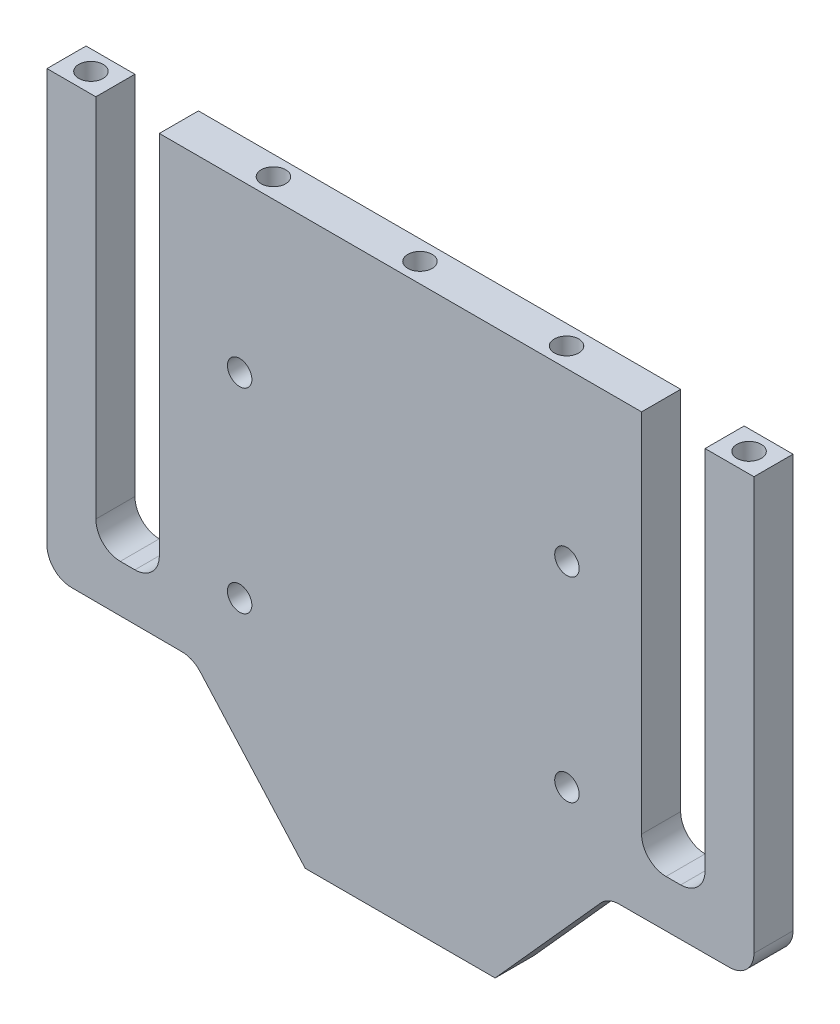
ISO-10303-21;
HEADER;
FILE_DESCRIPTION(('STEP AP214'),'2;1');
FILE_NAME('part.step','',(''),(''),'','','');
FILE_SCHEMA(('AUTOMOTIVE_DESIGN { 1 0 10303 214 1 1 1 1 }'));
ENDSEC;
DATA;
#1=APPLICATION_CONTEXT('core data for automotive mechanical design processes');
#2=APPLICATION_PROTOCOL_DEFINITION('international standard','automotive_design',2000,#1);
#3=PRODUCT_CONTEXT('',#1,'mechanical');
#4=PRODUCT('Part','Part','',(#3));
#5=PRODUCT_RELATED_PRODUCT_CATEGORY('part','',(#4));
#6=PRODUCT_DEFINITION_FORMATION('','',#4);
#7=PRODUCT_DEFINITION_CONTEXT('part definition',#1,'design');
#8=PRODUCT_DEFINITION('design','',#6,#7);
#9=PRODUCT_DEFINITION_SHAPE('','',#8);
#10=(LENGTH_UNIT() NAMED_UNIT(*) SI_UNIT(.MILLI.,.METRE.));
#11=(NAMED_UNIT(*) PLANE_ANGLE_UNIT() SI_UNIT($,.RADIAN.));
#12=(NAMED_UNIT(*) SI_UNIT($,.STERADIAN.) SOLID_ANGLE_UNIT());
#13=UNCERTAINTY_MEASURE_WITH_UNIT(LENGTH_MEASURE(1.E-05),#10,'distance_accuracy_value','');
#14=(GEOMETRIC_REPRESENTATION_CONTEXT(3) GLOBAL_UNCERTAINTY_ASSIGNED_CONTEXT((#13)) GLOBAL_UNIT_ASSIGNED_CONTEXT((#10,
#11,#12)) REPRESENTATION_CONTEXT('',''));
#15=CARTESIAN_POINT('',(0.,0.,0.));
#16=DIRECTION('',(0.,0.,1.));
#17=DIRECTION('',(1.,0.,0.));
#18=AXIS2_PLACEMENT_3D('',#15,#16,#17);
#19=CARTESIAN_POINT('',(142.361429131201,115.359943174136,8.01));
#20=DIRECTION('',(0.,-1.,0.));
#21=DIRECTION('',(0.,0.,-1.));
#22=AXIS2_PLACEMENT_3D('',#19,#20,#21);
#23=PLANE('',#22);
#24=CARTESIAN_POINT('',(137.361429131207,115.359943174136,4.));
#25=DIRECTION('',(0.,-1.,0.));
#26=DIRECTION('',(0.,0.,-1.));
#27=AXIS2_PLACEMENT_3D('',#24,#25,#26);
#28=CIRCLE('',#27,2.5);
#29=CARTESIAN_POINT('',(137.361429131207,115.359943174136,1.50000000000001));
#30=VERTEX_POINT('',#29);
#31=EDGE_CURVE('E944',#30,#30,#28,.T.);
#32=ORIENTED_EDGE('',*,*,#31,.T.);
#33=EDGE_LOOP('',(#32));
#34=FACE_BOUND('',#33,.T.);
#35=DIRECTION('',(1.,0.,0.));
#36=VECTOR('',#35,1.);
#37=CARTESIAN_POINT('',(114.734330831104,115.359943174136,8.));
#38=LINE('',#37,#36);
#39=CARTESIAN_POINT('',(132.361429131214,115.359943174136,8.));
#40=VERTEX_POINT('',#39);
#41=CARTESIAN_POINT('',(142.361429131201,115.359943174136,8.));
#42=VERTEX_POINT('',#41);
#43=EDGE_CURVE('E374',#40,#42,#38,.T.);
#44=ORIENTED_EDGE('',*,*,#43,.T.);
#45=DIRECTION('',(0.,0.,1.));
#46=VECTOR('',#45,1.);
#47=CARTESIAN_POINT('',(142.361429131201,115.359943174136,8.));
#48=LINE('',#47,#46);
#49=CARTESIAN_POINT('',(142.361429131201,115.359943174136,0.));
#50=VERTEX_POINT('',#49);
#51=EDGE_CURVE('E369',#50,#42,#48,.T.);
#52=ORIENTED_EDGE('',*,*,#51,.F.);
#53=DIRECTION('',(1.,0.,0.));
#54=VECTOR('',#53,1.);
#55=CARTESIAN_POINT('',(114.734330831104,115.359943174136,0.));
#56=LINE('',#55,#54);
#57=CARTESIAN_POINT('',(132.361429131214,115.359943174136,0.));
#58=VERTEX_POINT('',#57);
#59=EDGE_CURVE('E371',#58,#50,#56,.T.);
#60=ORIENTED_EDGE('',*,*,#59,.F.);
#61=DIRECTION('',(0.,0.,1.));
#62=VECTOR('',#61,1.);
#63=CARTESIAN_POINT('',(132.361429131214,115.359943174136,8.));
#64=LINE('',#63,#62);
#65=EDGE_CURVE('E45',#58,#40,#64,.T.);
#66=ORIENTED_EDGE('',*,*,#65,.T.);
#67=EDGE_LOOP('',(#44,#52,#60,#66));
#68=FACE_BOUND('',#67,.T.);
#69=ADVANCED_FACE('F41',(#34,#68),#23,.F.);
#70=CARTESIAN_POINT('',(100.,115.359943174136,4.));
#71=DIRECTION('',(0.,1.,0.));
#72=DIRECTION('',(0.,0.,1.));
#73=AXIS2_PLACEMENT_3D('',#70,#71,#72);
#74=CIRCLE('',#73,2.5);
#75=CARTESIAN_POINT('',(100.,115.359943174136,6.5));
#76=VERTEX_POINT('',#75);
#77=EDGE_CURVE('E924',#76,#76,#74,.F.);
#78=ORIENTED_EDGE('',*,*,#77,.T.);
#79=EDGE_LOOP('',(#78));
#80=FACE_BOUND('',#79,.T.);
#81=CARTESIAN_POINT('',(40.,115.359943174136,4.));
#82=DIRECTION('',(0.,-1.,0.));
#83=DIRECTION('',(0.,0.,-1.));
#84=AXIS2_PLACEMENT_3D('',#81,#82,#83);
#85=CIRCLE('',#84,2.5);
#86=CARTESIAN_POINT('',(40.,115.359943174136,1.50000000000001));
#87=VERTEX_POINT('',#86);
#88=EDGE_CURVE('E932',#87,#87,#85,.T.);
#89=ORIENTED_EDGE('',*,*,#88,.T.);
#90=EDGE_LOOP('',(#89));
#91=FACE_BOUND('',#90,.T.);
#92=CARTESIAN_POINT('',(70.,115.359943174136,4.));
#93=DIRECTION('',(0.,-1.,0.));
#94=DIRECTION('',(0.,0.,-1.));
#95=AXIS2_PLACEMENT_3D('',#92,#93,#94);
#96=CIRCLE('',#95,2.5);
#97=CARTESIAN_POINT('',(70.,115.359943174136,1.50000000000001));
#98=VERTEX_POINT('',#97);
#99=EDGE_CURVE('E938',#98,#98,#96,.T.);
#100=ORIENTED_EDGE('',*,*,#99,.T.);
#101=EDGE_LOOP('',(#100));
#102=FACE_BOUND('',#101,.T.);
#103=DIRECTION('',(0.,0.,-1.));
#104=VECTOR('',#103,1.);
#105=CARTESIAN_POINT('',(119.361429131214,115.359943174136,8.));
#106=LINE('',#105,#104);
#107=CARTESIAN_POINT('',(119.361429131214,115.359943174136,8.));
#108=VERTEX_POINT('',#107);
#109=CARTESIAN_POINT('',(119.361429131214,115.359943174136,0.));
#110=VERTEX_POINT('',#109);
#111=EDGE_CURVE('E380',#108,#110,#106,.T.);
#112=ORIENTED_EDGE('',*,*,#111,.T.);
#113=CARTESIAN_POINT('',(20.6385708687968,115.359943174136,0.));
#114=VERTEX_POINT('',#113);
#115=EDGE_CURVE('E373',#114,#110,#56,.T.);
#116=ORIENTED_EDGE('',*,*,#115,.F.);
#117=DIRECTION('',(0.,0.,1.));
#118=VECTOR('',#117,1.);
#119=CARTESIAN_POINT('',(20.6385708687968,115.359943174136,8.));
#120=LINE('',#119,#118);
#121=CARTESIAN_POINT('',(20.6385708687968,115.359943174136,8.));
#122=VERTEX_POINT('',#121);
#123=EDGE_CURVE('E50',#114,#122,#120,.T.);
#124=ORIENTED_EDGE('',*,*,#123,.T.);
#125=EDGE_CURVE('E377',#122,#108,#38,.T.);
#126=ORIENTED_EDGE('',*,*,#125,.T.);
#127=EDGE_LOOP('',(#112,#116,#124,#126));
#128=FACE_BOUND('',#127,.T.);
#129=ADVANCED_FACE('F414',(#80,#91,#102,#128),#23,.F.);
#130=CARTESIAN_POINT('',(2.63857086880265,115.359943174136,4.));
#131=DIRECTION('',(0.,-1.,0.));
#132=DIRECTION('',(0.,0.,-1.));
#133=AXIS2_PLACEMENT_3D('',#130,#131,#132);
#134=CIRCLE('',#133,2.5);
#135=CARTESIAN_POINT('',(2.63857086880265,115.359943174136,1.5));
#136=VERTEX_POINT('',#135);
#137=EDGE_CURVE('E927',#136,#136,#134,.T.);
#138=ORIENTED_EDGE('',*,*,#137,.T.);
#139=EDGE_LOOP('',(#138));
#140=FACE_BOUND('',#139,.T.);
#141=CARTESIAN_POINT('',(-2.3614291311915,115.359943174136,8.));
#142=VERTEX_POINT('',#141);
#143=CARTESIAN_POINT('',(7.63857086879679,115.359943174136,8.));
#144=VERTEX_POINT('',#143);
#145=EDGE_CURVE('E378',#142,#144,#38,.T.);
#146=ORIENTED_EDGE('',*,*,#145,.T.);
#147=DIRECTION('',(0.,0.,-1.));
#148=VECTOR('',#147,1.);
#149=CARTESIAN_POINT('',(7.63857086879679,115.359943174136,8.));
#150=LINE('',#149,#148);
#151=CARTESIAN_POINT('',(7.63857086879679,115.359943174136,0.));
#152=VERTEX_POINT('',#151);
#153=EDGE_CURVE('E11',#144,#152,#150,.T.);
#154=ORIENTED_EDGE('',*,*,#153,.T.);
#155=CARTESIAN_POINT('',(-2.3614291311915,115.359943174136,0.));
#156=VERTEX_POINT('',#155);
#157=EDGE_CURVE('E58',#156,#152,#56,.T.);
#158=ORIENTED_EDGE('',*,*,#157,.F.);
#159=DIRECTION('',(0.,0.,-1.));
#160=VECTOR('',#159,1.);
#161=CARTESIAN_POINT('',(-2.3614291311915,115.359943174136,8.));
#162=LINE('',#161,#160);
#163=EDGE_CURVE('E366',#142,#156,#162,.T.);
#164=ORIENTED_EDGE('',*,*,#163,.F.);
#165=EDGE_LOOP('',(#146,#154,#158,#164));
#166=FACE_BOUND('',#165,.T.);
#167=ADVANCED_FACE('F43',(#140,#166),#23,.F.);
#168=CARTESIAN_POINT('',(114.734330831104,20.7823478267735,8.));
#169=DIRECTION('',(0.,0.,1.));
#170=DIRECTION('',(1.,0.,0.));
#171=AXIS2_PLACEMENT_3D('',#168,#169,#170);
#172=PLANE('',#171);
#173=CARTESIAN_POINT('',(37.0785708687969,41.1924926620058,8.));
#174=DIRECTION('',(0.,0.,1.));
#175=DIRECTION('',(1.,0.,0.));
#176=AXIS2_PLACEMENT_3D('',#173,#174,#175);
#177=CIRCLE('',#176,2.5);
#178=CARTESIAN_POINT('',(39.5785708687969,41.1924926620058,8.));
#179=VERTEX_POINT('',#178);
#180=EDGE_CURVE('E905',#179,#179,#177,.T.);
#181=ORIENTED_EDGE('',*,*,#180,.F.);
#182=EDGE_LOOP('',(#181));
#183=FACE_BOUND('',#182,.T.);
#184=CARTESIAN_POINT('',(104.078570868797,41.1924926620058,8.));
#185=DIRECTION('',(0.,0.,1.));
#186=DIRECTION('',(1.,0.,0.));
#187=AXIS2_PLACEMENT_3D('',#184,#185,#186);
#188=CIRCLE('',#187,2.5);
#189=CARTESIAN_POINT('',(106.578570868797,41.1924926620058,8.));
#190=VERTEX_POINT('',#189);
#191=EDGE_CURVE('E909',#190,#190,#188,.T.);
#192=ORIENTED_EDGE('',*,*,#191,.F.);
#193=EDGE_LOOP('',(#192));
#194=FACE_BOUND('',#193,.T.);
#195=CARTESIAN_POINT('',(104.078570868797,81.1924926620058,8.));
#196=DIRECTION('',(0.,0.,1.));
#197=DIRECTION('',(1.,0.,0.));
#198=AXIS2_PLACEMENT_3D('',#195,#196,#197);
#199=CIRCLE('',#198,2.5);
#200=CARTESIAN_POINT('',(106.578570868797,81.1924926620058,8.));
#201=VERTEX_POINT('',#200);
#202=EDGE_CURVE('E921',#201,#201,#199,.T.);
#203=ORIENTED_EDGE('',*,*,#202,.F.);
#204=EDGE_LOOP('',(#203));
#205=FACE_BOUND('',#204,.T.);
#206=CARTESIAN_POINT('',(37.0785708687969,81.1924926620058,8.));
#207=DIRECTION('',(0.,0.,1.));
#208=DIRECTION('',(1.,0.,0.));
#209=AXIS2_PLACEMENT_3D('',#206,#207,#208);
#210=CIRCLE('',#209,2.5);
#211=CARTESIAN_POINT('',(39.5785708687969,81.1924926620058,8.));
#212=VERTEX_POINT('',#211);
#213=EDGE_CURVE('E918',#212,#212,#210,.T.);
#214=ORIENTED_EDGE('',*,*,#213,.F.);
#215=EDGE_LOOP('',(#214));
#216=FACE_BOUND('',#215,.T.);
#217=ORIENTED_EDGE('',*,*,#145,.F.);
#218=DIRECTION('',(0.,-1.,0.));
#219=VECTOR('',#218,1.);
#220=CARTESIAN_POINT('',(-2.3614291311915,214.274017901078,8.));
#221=LINE('',#220,#219);
#222=CARTESIAN_POINT('',(-2.36142913119149,30.8599431741363,8.));
#223=VERTEX_POINT('',#222);
#224=EDGE_CURVE('E307',#142,#223,#221,.T.);
#225=ORIENTED_EDGE('',*,*,#224,.T.);
#226=CARTESIAN_POINT('',(2.63857086880851,30.8599431741363,8.));
#227=DIRECTION('',(0.,0.,1.));
#228=DIRECTION('',(-1.,0.,0.));
#229=AXIS2_PLACEMENT_3D('',#226,#227,#228);
#230=CIRCLE('',#229,5.);
#231=CARTESIAN_POINT('',(2.63857086880812,25.8599431741363,8.));
#232=VERTEX_POINT('',#231);
#233=EDGE_CURVE('E309',#223,#232,#230,.T.);
#234=ORIENTED_EDGE('',*,*,#233,.T.);
#235=DIRECTION('',(0.999994124417924,-0.00342799206976642,0.));
#236=VECTOR('',#235,1.);
#237=CARTESIAN_POINT('',(25.2828091292453,25.7823184488632,8.));
#238=LINE('',#237,#236);
#239=CARTESIAN_POINT('',(25.2828091292453,25.7823184488632,8.));
#240=VERTEX_POINT('',#239);
#241=EDGE_CURVE('E311',#232,#240,#238,.T.);
#242=ORIENTED_EDGE('',*,*,#241,.T.);
#243=CARTESIAN_POINT('',(25.2656691688965,20.7823478267735,8.));
#244=DIRECTION('',(0.,0.,-1.));
#245=DIRECTION('',(-1.,0.,0.));
#246=AXIS2_PLACEMENT_3D('',#243,#244,#245);
#247=CIRCLE('',#246,5.);
#248=CARTESIAN_POINT('',(28.9972260111802,24.1103327325094,8.));
#249=VERTEX_POINT('',#248);
#250=EDGE_CURVE('E313',#240,#249,#247,.T.);
#251=ORIENTED_EDGE('',*,*,#250,.T.);
#252=DIRECTION('',(0.665596981147171,-0.74631136845674,0.));
#253=VECTOR('',#252,1.);
#254=CARTESIAN_POINT('',(28.9972260111802,24.1103327325094,8.));
#255=LINE('',#254,#253);
#256=CARTESIAN_POINT('',(50.5,0.,8.));
#257=VERTEX_POINT('',#256);
#258=EDGE_CURVE('E290',#249,#257,#255,.T.);
#259=ORIENTED_EDGE('',*,*,#258,.T.);
#260=DIRECTION('',(1.,0.,0.));
#261=VECTOR('',#260,1.);
#262=CARTESIAN_POINT('',(89.3828592898621,0.,8.));
#263=LINE('',#262,#261);
#264=CARTESIAN_POINT('',(89.3828592898621,0.,8.));
#265=VERTEX_POINT('',#264);
#266=EDGE_CURVE('E293',#257,#265,#263,.T.);
#267=ORIENTED_EDGE('',*,*,#266,.T.);
#268=DIRECTION('',(0.667609283497738,0.744511816284763,0.));
#269=VECTOR('',#268,1.);
#270=CARTESIAN_POINT('',(89.3828592898621,0.,8.));
#271=LINE('',#270,#269);
#272=CARTESIAN_POINT('',(111.00277398882,24.1103327325094,8.));
#273=VERTEX_POINT('',#272);
#274=EDGE_CURVE('E296',#265,#273,#271,.T.);
#275=ORIENTED_EDGE('',*,*,#274,.T.);
#276=CARTESIAN_POINT('',(114.734330831104,20.7823478267735,8.));
#277=DIRECTION('',(0.,0.,-1.));
#278=DIRECTION('',(1.,0.,0.));
#279=AXIS2_PLACEMENT_3D('',#276,#277,#278);
#280=CIRCLE('',#279,5.);
#281=CARTESIAN_POINT('',(114.717190870755,25.7823184488632,8.));
#282=VERTEX_POINT('',#281);
#283=EDGE_CURVE('E298',#273,#282,#280,.T.);
#284=ORIENTED_EDGE('',*,*,#283,.T.);
#285=DIRECTION('',(0.999994124417924,0.00342799206976557,0.));
#286=VECTOR('',#285,1.);
#287=CARTESIAN_POINT('',(114.717190870755,25.7823184488632,8.));
#288=LINE('',#287,#286);
#289=CARTESIAN_POINT('',(137.361429131203,25.8599431741363,8.));
#290=VERTEX_POINT('',#289);
#291=EDGE_CURVE('E300',#282,#290,#288,.T.);
#292=ORIENTED_EDGE('',*,*,#291,.T.);
#293=CARTESIAN_POINT('',(137.361429131202,30.8599431741363,8.));
#294=DIRECTION('',(0.,0.,1.));
#295=DIRECTION('',(1.,0.,0.));
#296=AXIS2_PLACEMENT_3D('',#293,#294,#295);
#297=CIRCLE('',#296,4.99999999999935);
#298=CARTESIAN_POINT('',(142.361429131202,30.8599431741363,8.));
#299=VERTEX_POINT('',#298);
#300=EDGE_CURVE('E302',#290,#299,#297,.T.);
#301=ORIENTED_EDGE('',*,*,#300,.T.);
#302=DIRECTION('',(0.,1.,0.));
#303=VECTOR('',#302,1.);
#304=CARTESIAN_POINT('',(142.361429131201,214.274017901078,8.));
#305=LINE('',#304,#303);
#306=EDGE_CURVE('E304',#299,#42,#305,.T.);
#307=ORIENTED_EDGE('',*,*,#306,.T.);
#308=ORIENTED_EDGE('',*,*,#43,.F.);
#309=DIRECTION('',(0.,1.,0.));
#310=VECTOR('',#309,1.);
#311=CARTESIAN_POINT('',(132.361429131214,213.625959477353,8.));
#312=LINE('',#311,#310);
#313=CARTESIAN_POINT('',(132.361429131214,40.4924926620058,8.));
#314=VERTEX_POINT('',#313);
#315=EDGE_CURVE('E262',#314,#40,#312,.T.);
#316=ORIENTED_EDGE('',*,*,#315,.F.);
#317=CARTESIAN_POINT('',(127.361429131214,40.4924926620058,8.));
#318=DIRECTION('',(0.,0.,1.));
#319=DIRECTION('',(1.,0.,0.));
#320=AXIS2_PLACEMENT_3D('',#317,#318,#319);
#321=CIRCLE('',#320,5.);
#322=CARTESIAN_POINT('',(127.361429131214,35.4924926620058,8.));
#323=VERTEX_POINT('',#322);
#324=EDGE_CURVE('E260',#323,#314,#321,.T.);
#325=ORIENTED_EDGE('',*,*,#324,.F.);
#326=DIRECTION('',(1.,0.,0.));
#327=VECTOR('',#326,1.);
#328=CARTESIAN_POINT('',(127.361429131214,35.4924926620058,8.));
#329=LINE('',#328,#327);
#330=CARTESIAN_POINT('',(124.361429131214,35.4924926620058,8.));
#331=VERTEX_POINT('',#330);
#332=EDGE_CURVE('E257',#331,#323,#329,.T.);
#333=ORIENTED_EDGE('',*,*,#332,.F.);
#334=CARTESIAN_POINT('',(124.361429131214,40.4924926620058,8.));
#335=DIRECTION('',(0.,0.,1.));
#336=DIRECTION('',(-1.,0.,0.));
#337=AXIS2_PLACEMENT_3D('',#334,#335,#336);
#338=CIRCLE('',#337,5.);
#339=CARTESIAN_POINT('',(119.361429131214,40.4924926620058,8.));
#340=VERTEX_POINT('',#339);
#341=EDGE_CURVE('E255',#340,#331,#338,.T.);
#342=ORIENTED_EDGE('',*,*,#341,.F.);
#343=DIRECTION('',(0.,-1.,0.));
#344=VECTOR('',#343,1.);
#345=CARTESIAN_POINT('',(119.361429131214,40.4924926620058,8.));
#346=LINE('',#345,#344);
#347=EDGE_CURVE('E265',#108,#340,#346,.T.);
#348=ORIENTED_EDGE('',*,*,#347,.F.);
#349=ORIENTED_EDGE('',*,*,#125,.F.);
#350=DIRECTION('',(0.,1.,0.));
#351=VECTOR('',#350,1.);
#352=CARTESIAN_POINT('',(20.6385708687969,40.4924926620058,8.));
#353=LINE('',#352,#351);
#354=CARTESIAN_POINT('',(20.6385708687969,40.4924926620058,8.));
#355=VERTEX_POINT('',#354);
#356=EDGE_CURVE('E232',#355,#122,#353,.T.);
#357=ORIENTED_EDGE('',*,*,#356,.F.);
#358=CARTESIAN_POINT('',(15.6385708687969,40.4924926620058,8.));
#359=DIRECTION('',(0.,0.,1.));
#360=DIRECTION('',(1.,0.,0.));
#361=AXIS2_PLACEMENT_3D('',#358,#359,#360);
#362=CIRCLE('',#361,5.);
#363=CARTESIAN_POINT('',(15.6385708687968,35.4924926620058,8.));
#364=VERTEX_POINT('',#363);
#365=EDGE_CURVE('E230',#364,#355,#362,.T.);
#366=ORIENTED_EDGE('',*,*,#365,.F.);
#367=DIRECTION('',(1.,0.,0.));
#368=VECTOR('',#367,1.);
#369=CARTESIAN_POINT('',(12.6385708687969,35.4924926620058,8.));
#370=LINE('',#369,#368);
#371=CARTESIAN_POINT('',(12.6385708687969,35.4924926620058,8.));
#372=VERTEX_POINT('',#371);
#373=EDGE_CURVE('E215',#372,#364,#370,.T.);
#374=ORIENTED_EDGE('',*,*,#373,.F.);
#375=CARTESIAN_POINT('',(12.6385708687968,40.4924926620058,8.));
#376=DIRECTION('',(0.,0.,1.));
#377=DIRECTION('',(-1.,0.,0.));
#378=AXIS2_PLACEMENT_3D('',#375,#376,#377);
#379=CIRCLE('',#378,5.);
#380=CARTESIAN_POINT('',(7.63857086879684,40.4924926620058,8.));
#381=VERTEX_POINT('',#380);
#382=EDGE_CURVE('E204',#381,#372,#379,.T.);
#383=ORIENTED_EDGE('',*,*,#382,.F.);
#384=DIRECTION('',(0.,-1.,0.));
#385=VECTOR('',#384,1.);
#386=CARTESIAN_POINT('',(7.63857086879674,213.625959477353,8.));
#387=LINE('',#386,#385);
#388=EDGE_CURVE('E238',#144,#381,#387,.T.);
#389=ORIENTED_EDGE('',*,*,#388,.F.);
#390=EDGE_LOOP('',(#217,#225,#234,#242,#251,#259,#267,#275,#284,#292,#301,#307,#308,#316,#325,
#333,#342,#348,#349,#357,#366,#374,#383,#389));
#391=FACE_BOUND('',#390,.T.);
#392=ADVANCED_FACE('F228',(#183,#194,#205,#216,#391),#172,.T.);
#393=CARTESIAN_POINT('',(114.734330831104,20.7823478267735,0.));
#394=DIRECTION('',(0.,0.,1.));
#395=DIRECTION('',(1.,0.,0.));
#396=AXIS2_PLACEMENT_3D('',#393,#394,#395);
#397=PLANE('',#396);
#398=CARTESIAN_POINT('',(37.0785708687969,41.1924926620058,0.));
#399=DIRECTION('',(0.,0.,1.));
#400=DIRECTION('',(1.,0.,0.));
#401=AXIS2_PLACEMENT_3D('',#398,#399,#400);
#402=CIRCLE('',#401,2.5);
#403=CARTESIAN_POINT('',(39.5785708687969,41.1924926620058,0.));
#404=VERTEX_POINT('',#403);
#405=EDGE_CURVE('E902',#404,#404,#402,.T.);
#406=ORIENTED_EDGE('',*,*,#405,.T.);
#407=EDGE_LOOP('',(#406));
#408=FACE_BOUND('',#407,.T.);
#409=CARTESIAN_POINT('',(104.078570868797,41.1924926620058,0.));
#410=DIRECTION('',(0.,0.,1.));
#411=DIRECTION('',(1.,0.,0.));
#412=AXIS2_PLACEMENT_3D('',#409,#410,#411);
#413=CIRCLE('',#412,2.5);
#414=CARTESIAN_POINT('',(106.578570868797,41.1924926620058,0.));
#415=VERTEX_POINT('',#414);
#416=EDGE_CURVE('E906',#415,#415,#413,.T.);
#417=ORIENTED_EDGE('',*,*,#416,.T.);
#418=EDGE_LOOP('',(#417));
#419=FACE_BOUND('',#418,.T.);
#420=CARTESIAN_POINT('',(104.078570868797,81.1924926620058,0.));
#421=DIRECTION('',(0.,0.,1.));
#422=DIRECTION('',(1.,0.,0.));
#423=AXIS2_PLACEMENT_3D('',#420,#421,#422);
#424=CIRCLE('',#423,2.5);
#425=CARTESIAN_POINT('',(106.578570868797,81.1924926620058,0.));
#426=VERTEX_POINT('',#425);
#427=EDGE_CURVE('E966',#426,#426,#424,.T.);
#428=ORIENTED_EDGE('',*,*,#427,.T.);
#429=EDGE_LOOP('',(#428));
#430=FACE_BOUND('',#429,.T.);
#431=CARTESIAN_POINT('',(37.0785708687969,81.1924926620058,0.));
#432=DIRECTION('',(0.,0.,1.));
#433=DIRECTION('',(1.,0.,0.));
#434=AXIS2_PLACEMENT_3D('',#431,#432,#433);
#435=CIRCLE('',#434,2.5);
#436=CARTESIAN_POINT('',(39.5785708687969,81.1924926620058,0.));
#437=VERTEX_POINT('',#436);
#438=EDGE_CURVE('E914',#437,#437,#435,.T.);
#439=ORIENTED_EDGE('',*,*,#438,.T.);
#440=EDGE_LOOP('',(#439));
#441=FACE_BOUND('',#440,.T.);
#442=DIRECTION('',(0.,-1.,0.));
#443=VECTOR('',#442,1.);
#444=CARTESIAN_POINT('',(-2.3614291311915,214.274017901078,0.));
#445=LINE('',#444,#443);
#446=CARTESIAN_POINT('',(-2.36142913119149,30.8599431741363,0.));
#447=VERTEX_POINT('',#446);
#448=EDGE_CURVE('E331',#156,#447,#445,.T.);
#449=ORIENTED_EDGE('',*,*,#448,.F.);
#450=ORIENTED_EDGE('',*,*,#157,.T.);
#451=DIRECTION('',(0.,-1.,0.));
#452=VECTOR('',#451,1.);
#453=CARTESIAN_POINT('',(7.63857086879674,213.625959477353,0.));
#454=LINE('',#453,#452);
#455=CARTESIAN_POINT('',(7.63857086879684,40.4924926620058,0.));
#456=VERTEX_POINT('',#455);
#457=EDGE_CURVE('E216',#152,#456,#454,.T.);
#458=ORIENTED_EDGE('',*,*,#457,.T.);
#459=CARTESIAN_POINT('',(12.6385708687968,40.4924926620058,0.));
#460=DIRECTION('',(0.,0.,1.));
#461=DIRECTION('',(-1.,0.,0.));
#462=AXIS2_PLACEMENT_3D('',#459,#460,#461);
#463=CIRCLE('',#462,5.);
#464=CARTESIAN_POINT('',(12.6385708687969,35.4924926620058,0.));
#465=VERTEX_POINT('',#464);
#466=EDGE_CURVE('E240',#456,#465,#463,.T.);
#467=ORIENTED_EDGE('',*,*,#466,.T.);
#468=DIRECTION('',(1.,0.,0.));
#469=VECTOR('',#468,1.);
#470=CARTESIAN_POINT('',(12.6385708687969,35.4924926620058,0.));
#471=LINE('',#470,#469);
#472=CARTESIAN_POINT('',(15.6385708687968,35.4924926620058,0.));
#473=VERTEX_POINT('',#472);
#474=EDGE_CURVE('E222',#465,#473,#471,.T.);
#475=ORIENTED_EDGE('',*,*,#474,.T.);
#476=CARTESIAN_POINT('',(15.6385708687969,40.4924926620058,0.));
#477=DIRECTION('',(0.,0.,1.));
#478=DIRECTION('',(1.,0.,0.));
#479=AXIS2_PLACEMENT_3D('',#476,#477,#478);
#480=CIRCLE('',#479,5.);
#481=CARTESIAN_POINT('',(20.6385708687969,40.4924926620058,0.));
#482=VERTEX_POINT('',#481);
#483=EDGE_CURVE('E244',#473,#482,#480,.T.);
#484=ORIENTED_EDGE('',*,*,#483,.T.);
#485=DIRECTION('',(0.,1.,0.));
#486=VECTOR('',#485,1.);
#487=CARTESIAN_POINT('',(20.6385708687969,40.4924926620058,0.));
#488=LINE('',#487,#486);
#489=EDGE_CURVE('E247',#482,#114,#488,.T.);
#490=ORIENTED_EDGE('',*,*,#489,.T.);
#491=ORIENTED_EDGE('',*,*,#115,.T.);
#492=DIRECTION('',(0.,-1.,0.));
#493=VECTOR('',#492,1.);
#494=CARTESIAN_POINT('',(119.361429131214,40.4924926620058,0.));
#495=LINE('',#494,#493);
#496=CARTESIAN_POINT('',(119.361429131214,40.4924926620058,0.));
#497=VERTEX_POINT('',#496);
#498=EDGE_CURVE('E258',#110,#497,#495,.T.);
#499=ORIENTED_EDGE('',*,*,#498,.T.);
#500=CARTESIAN_POINT('',(124.361429131214,40.4924926620058,0.));
#501=DIRECTION('',(0.,0.,1.));
#502=DIRECTION('',(-1.,0.,0.));
#503=AXIS2_PLACEMENT_3D('',#500,#501,#502);
#504=CIRCLE('',#503,5.);
#505=CARTESIAN_POINT('',(124.361429131214,35.4924926620058,0.));
#506=VERTEX_POINT('',#505);
#507=EDGE_CURVE('E223',#497,#506,#504,.T.);
#508=ORIENTED_EDGE('',*,*,#507,.T.);
#509=DIRECTION('',(1.,0.,0.));
#510=VECTOR('',#509,1.);
#511=CARTESIAN_POINT('',(127.361429131214,35.4924926620058,0.));
#512=LINE('',#511,#510);
#513=CARTESIAN_POINT('',(127.361429131214,35.4924926620058,0.));
#514=VERTEX_POINT('',#513);
#515=EDGE_CURVE('E270',#506,#514,#512,.T.);
#516=ORIENTED_EDGE('',*,*,#515,.T.);
#517=CARTESIAN_POINT('',(127.361429131214,40.4924926620058,0.));
#518=DIRECTION('',(0.,0.,1.));
#519=DIRECTION('',(1.,0.,0.));
#520=AXIS2_PLACEMENT_3D('',#517,#518,#519);
#521=CIRCLE('',#520,5.);
#522=CARTESIAN_POINT('',(132.361429131214,40.4924926620058,0.));
#523=VERTEX_POINT('',#522);
#524=EDGE_CURVE('E273',#514,#523,#521,.T.);
#525=ORIENTED_EDGE('',*,*,#524,.T.);
#526=DIRECTION('',(0.,1.,0.));
#527=VECTOR('',#526,1.);
#528=CARTESIAN_POINT('',(132.361429131214,213.625959477353,0.));
#529=LINE('',#528,#527);
#530=EDGE_CURVE('E276',#523,#58,#529,.T.);
#531=ORIENTED_EDGE('',*,*,#530,.T.);
#532=ORIENTED_EDGE('',*,*,#59,.T.);
#533=DIRECTION('',(0.,1.,0.));
#534=VECTOR('',#533,1.);
#535=CARTESIAN_POINT('',(142.361429131201,214.274017901078,0.));
#536=LINE('',#535,#534);
#537=CARTESIAN_POINT('',(142.361429131202,30.8599431741363,0.));
#538=VERTEX_POINT('',#537);
#539=EDGE_CURVE('E328',#538,#50,#536,.T.);
#540=ORIENTED_EDGE('',*,*,#539,.F.);
#541=CARTESIAN_POINT('',(137.361429131202,30.8599431741363,0.));
#542=DIRECTION('',(0.,0.,1.));
#543=DIRECTION('',(1.,0.,0.));
#544=AXIS2_PLACEMENT_3D('',#541,#542,#543);
#545=CIRCLE('',#544,4.99999999999935);
#546=CARTESIAN_POINT('',(137.361429131203,25.8599431741363,0.));
#547=VERTEX_POINT('',#546);
#548=EDGE_CURVE('E326',#547,#538,#545,.T.);
#549=ORIENTED_EDGE('',*,*,#548,.F.);
#550=DIRECTION('',(0.999994124417924,0.00342799206976557,0.));
#551=VECTOR('',#550,1.);
#552=CARTESIAN_POINT('',(114.717190870755,25.7823184488632,0.));
#553=LINE('',#552,#551);
#554=CARTESIAN_POINT('',(114.717190870755,25.7823184488632,0.));
#555=VERTEX_POINT('',#554);
#556=EDGE_CURVE('E324',#555,#547,#553,.T.);
#557=ORIENTED_EDGE('',*,*,#556,.F.);
#558=CARTESIAN_POINT('',(114.734330831104,20.7823478267735,0.));
#559=DIRECTION('',(0.,0.,-1.));
#560=DIRECTION('',(1.,0.,0.));
#561=AXIS2_PLACEMENT_3D('',#558,#559,#560);
#562=CIRCLE('',#561,5.);
#563=CARTESIAN_POINT('',(111.00277398882,24.1103327325094,0.));
#564=VERTEX_POINT('',#563);
#565=EDGE_CURVE('E322',#564,#555,#562,.T.);
#566=ORIENTED_EDGE('',*,*,#565,.F.);
#567=DIRECTION('',(0.667609283497738,0.744511816284763,0.));
#568=VECTOR('',#567,1.);
#569=CARTESIAN_POINT('',(89.3828592898621,0.,0.));
#570=LINE('',#569,#568);
#571=CARTESIAN_POINT('',(89.3828592898621,0.,0.));
#572=VERTEX_POINT('',#571);
#573=EDGE_CURVE('E320',#572,#564,#570,.T.);
#574=ORIENTED_EDGE('',*,*,#573,.F.);
#575=DIRECTION('',(1.,0.,0.));
#576=VECTOR('',#575,1.);
#577=CARTESIAN_POINT('',(89.3828592898621,0.,0.));
#578=LINE('',#577,#576);
#579=CARTESIAN_POINT('',(50.5,0.,0.));
#580=VERTEX_POINT('',#579);
#581=EDGE_CURVE('E318',#580,#572,#578,.T.);
#582=ORIENTED_EDGE('',*,*,#581,.F.);
#583=DIRECTION('',(0.665596981147171,-0.74631136845674,0.));
#584=VECTOR('',#583,1.);
#585=CARTESIAN_POINT('',(28.9972260111802,24.1103327325094,0.));
#586=LINE('',#585,#584);
#587=CARTESIAN_POINT('',(28.9972260111802,24.1103327325094,0.));
#588=VERTEX_POINT('',#587);
#589=EDGE_CURVE('E289',#588,#580,#586,.T.);
#590=ORIENTED_EDGE('',*,*,#589,.F.);
#591=CARTESIAN_POINT('',(25.2656691688965,20.7823478267735,0.));
#592=DIRECTION('',(0.,0.,-1.));
#593=DIRECTION('',(-1.,0.,0.));
#594=AXIS2_PLACEMENT_3D('',#591,#592,#593);
#595=CIRCLE('',#594,5.);
#596=CARTESIAN_POINT('',(25.2828091292453,25.7823184488632,0.));
#597=VERTEX_POINT('',#596);
#598=EDGE_CURVE('E294',#597,#588,#595,.T.);
#599=ORIENTED_EDGE('',*,*,#598,.F.);
#600=DIRECTION('',(0.999994124417924,-0.00342799206976642,0.));
#601=VECTOR('',#600,1.);
#602=CARTESIAN_POINT('',(25.2828091292453,25.7823184488632,0.));
#603=LINE('',#602,#601);
#604=CARTESIAN_POINT('',(2.63857086880812,25.8599431741363,0.));
#605=VERTEX_POINT('',#604);
#606=EDGE_CURVE('E335',#605,#597,#603,.T.);
#607=ORIENTED_EDGE('',*,*,#606,.F.);
#608=CARTESIAN_POINT('',(2.63857086880851,30.8599431741363,0.));
#609=DIRECTION('',(0.,0.,1.));
#610=DIRECTION('',(-1.,0.,0.));
#611=AXIS2_PLACEMENT_3D('',#608,#609,#610);
#612=CIRCLE('',#611,5.);
#613=EDGE_CURVE('E333',#447,#605,#612,.T.);
#614=ORIENTED_EDGE('',*,*,#613,.F.);
#615=EDGE_LOOP('',(#449,#450,#458,#467,#475,#484,#490,#491,#499,#508,#516,#525,#531,#532,#540,
#549,#557,#566,#574,#582,#590,#599,#607,#614));
#616=FACE_BOUND('',#615,.T.);
#617=ADVANCED_FACE('F411',(#408,#419,#430,#441,#616),#397,.F.);
#618=CARTESIAN_POINT('',(28.9972260111802,24.1103327325094,8.));
#619=DIRECTION('',(0.74631136845674,0.665596981147171,0.));
#620=DIRECTION('',(-0.665596981147171,0.74631136845674,0.));
#621=AXIS2_PLACEMENT_3D('',#618,#619,#620);
#622=PLANE('',#621);
#623=ORIENTED_EDGE('',*,*,#589,.T.);
#624=DIRECTION('',(0.,0.,-1.));
#625=VECTOR('',#624,1.);
#626=CARTESIAN_POINT('',(50.5,0.,8.));
#627=LINE('',#626,#625);
#628=EDGE_CURVE('E364',#257,#580,#627,.T.);
#629=ORIENTED_EDGE('',*,*,#628,.F.);
#630=ORIENTED_EDGE('',*,*,#258,.F.);
#631=DIRECTION('',(0.,0.,-1.));
#632=VECTOR('',#631,1.);
#633=CARTESIAN_POINT('',(28.9972260111802,24.1103327325094,8.));
#634=LINE('',#633,#632);
#635=EDGE_CURVE('E315',#249,#588,#634,.T.);
#636=ORIENTED_EDGE('',*,*,#635,.T.);
#637=EDGE_LOOP('',(#623,#629,#630,#636));
#638=FACE_BOUND('',#637,.T.);
#639=ADVANCED_FACE('F447',(#638),#622,.F.);
#640=CARTESIAN_POINT('',(89.3828592898621,0.,8.));
#641=DIRECTION('',(0.,1.,0.));
#642=DIRECTION('',(0.,0.,1.));
#643=AXIS2_PLACEMENT_3D('',#640,#641,#642);
#644=PLANE('',#643);
#645=ORIENTED_EDGE('',*,*,#581,.T.);
#646=DIRECTION('',(0.,0.,-1.));
#647=VECTOR('',#646,1.);
#648=CARTESIAN_POINT('',(89.3828592898621,0.,8.));
#649=LINE('',#648,#647);
#650=EDGE_CURVE('E361',#265,#572,#649,.T.);
#651=ORIENTED_EDGE('',*,*,#650,.F.);
#652=ORIENTED_EDGE('',*,*,#266,.F.);
#653=ORIENTED_EDGE('',*,*,#628,.T.);
#654=EDGE_LOOP('',(#645,#651,#652,#653));
#655=FACE_BOUND('',#654,.T.);
#656=ADVANCED_FACE('F452',(#655),#644,.F.);
#657=CARTESIAN_POINT('',(89.3828592898621,0.,8.));
#658=DIRECTION('',(-0.744511816284763,0.667609283497738,0.));
#659=DIRECTION('',(-0.667609283497738,-0.744511816284763,0.));
#660=AXIS2_PLACEMENT_3D('',#657,#658,#659);
#661=PLANE('',#660);
#662=ORIENTED_EDGE('',*,*,#573,.T.);
#663=DIRECTION('',(0.,0.,-1.));
#664=VECTOR('',#663,1.);
#665=CARTESIAN_POINT('',(111.00277398882,24.1103327325094,8.));
#666=LINE('',#665,#664);
#667=EDGE_CURVE('E358',#273,#564,#666,.T.);
#668=ORIENTED_EDGE('',*,*,#667,.F.);
#669=ORIENTED_EDGE('',*,*,#274,.F.);
#670=ORIENTED_EDGE('',*,*,#650,.T.);
#671=EDGE_LOOP('',(#662,#668,#669,#670));
#672=FACE_BOUND('',#671,.T.);
#673=ADVANCED_FACE('F455',(#672),#661,.F.);
#674=CARTESIAN_POINT('',(114.734330831104,20.7823478267735,8.));
#675=DIRECTION('',(0.,0.,-1.));
#676=DIRECTION('',(-1.,0.,0.));
#677=AXIS2_PLACEMENT_3D('',#674,#675,#676);
#678=CYLINDRICAL_SURFACE('',#677,5.);
#679=ORIENTED_EDGE('',*,*,#565,.T.);
#680=DIRECTION('',(0.,0.,-1.));
#681=VECTOR('',#680,1.);
#682=CARTESIAN_POINT('',(114.717190870755,25.7823184488632,8.));
#683=LINE('',#682,#681);
#684=EDGE_CURVE('E355',#282,#555,#683,.T.);
#685=ORIENTED_EDGE('',*,*,#684,.F.);
#686=ORIENTED_EDGE('',*,*,#283,.F.);
#687=ORIENTED_EDGE('',*,*,#667,.T.);
#688=EDGE_LOOP('',(#679,#685,#686,#687));
#689=FACE_BOUND('',#688,.T.);
#690=ADVANCED_FACE('F460',(#689),#678,.F.);
#691=CARTESIAN_POINT('',(114.717190870755,25.7823184488632,8.));
#692=DIRECTION('',(-0.00342799206976556,0.999994124417924,0.));
#693=DIRECTION('',(-0.999994124417924,-0.00342799206976556,0.));
#694=AXIS2_PLACEMENT_3D('',#691,#692,#693);
#695=PLANE('',#694);
#696=ORIENTED_EDGE('',*,*,#556,.T.);
#697=DIRECTION('',(0.,0.,-1.));
#698=VECTOR('',#697,1.);
#699=CARTESIAN_POINT('',(137.361429131203,25.8599431741363,8.));
#700=LINE('',#699,#698);
#701=EDGE_CURVE('E352',#290,#547,#700,.T.);
#702=ORIENTED_EDGE('',*,*,#701,.F.);
#703=ORIENTED_EDGE('',*,*,#291,.F.);
#704=ORIENTED_EDGE('',*,*,#684,.T.);
#705=EDGE_LOOP('',(#696,#702,#703,#704));
#706=FACE_BOUND('',#705,.T.);
#707=ADVANCED_FACE('F466',(#706),#695,.F.);
#708=CARTESIAN_POINT('',(137.361429131202,30.8599431741363,8.));
#709=DIRECTION('',(0.,0.,-1.));
#710=DIRECTION('',(-1.,0.,0.));
#711=AXIS2_PLACEMENT_3D('',#708,#709,#710);
#712=CYLINDRICAL_SURFACE('',#711,4.99999999999935);
#713=ORIENTED_EDGE('',*,*,#548,.T.);
#714=DIRECTION('',(0.,0.,-1.));
#715=VECTOR('',#714,1.);
#716=CARTESIAN_POINT('',(142.361429131202,30.8599431741363,8.));
#717=LINE('',#716,#715);
#718=EDGE_CURVE('E349',#299,#538,#717,.T.);
#719=ORIENTED_EDGE('',*,*,#718,.F.);
#720=ORIENTED_EDGE('',*,*,#300,.F.);
#721=ORIENTED_EDGE('',*,*,#701,.T.);
#722=EDGE_LOOP('',(#713,#719,#720,#721));
#723=FACE_BOUND('',#722,.T.);
#724=ADVANCED_FACE('F470',(#723),#712,.T.);
#725=CARTESIAN_POINT('',(142.361429131201,214.274017901078,8.));
#726=DIRECTION('',(-1.,0.,0.));
#727=DIRECTION('',(0.,-1.,0.));
#728=AXIS2_PLACEMENT_3D('',#725,#726,#727);
#729=PLANE('',#728);
#730=ORIENTED_EDGE('',*,*,#539,.T.);
#731=ORIENTED_EDGE('',*,*,#51,.T.);
#732=ORIENTED_EDGE('',*,*,#306,.F.);
#733=ORIENTED_EDGE('',*,*,#718,.T.);
#734=EDGE_LOOP('',(#730,#731,#732,#733));
#735=FACE_BOUND('',#734,.T.);
#736=ADVANCED_FACE('F473',(#735),#729,.F.);
#737=CARTESIAN_POINT('',(-2.3614291311915,214.274017901078,8.));
#738=DIRECTION('',(1.,0.,0.));
#739=DIRECTION('',(0.,1.,0.));
#740=AXIS2_PLACEMENT_3D('',#737,#738,#739);
#741=PLANE('',#740);
#742=ORIENTED_EDGE('',*,*,#224,.F.);
#743=ORIENTED_EDGE('',*,*,#163,.T.);
#744=ORIENTED_EDGE('',*,*,#448,.T.);
#745=DIRECTION('',(0.,0.,-1.));
#746=VECTOR('',#745,1.);
#747=CARTESIAN_POINT('',(-2.36142913119149,30.8599431741363,8.));
#748=LINE('',#747,#746);
#749=EDGE_CURVE('E346',#223,#447,#748,.T.);
#750=ORIENTED_EDGE('',*,*,#749,.F.);
#751=EDGE_LOOP('',(#742,#743,#744,#750));
#752=FACE_BOUND('',#751,.T.);
#753=ADVANCED_FACE('F427',(#752),#741,.F.);
#754=CARTESIAN_POINT('',(2.63857086880851,30.8599431741363,8.));
#755=DIRECTION('',(0.,0.,-1.));
#756=DIRECTION('',(-1.,0.,0.));
#757=AXIS2_PLACEMENT_3D('',#754,#755,#756);
#758=CYLINDRICAL_SURFACE('',#757,5.);
#759=ORIENTED_EDGE('',*,*,#613,.T.);
#760=DIRECTION('',(0.,0.,-1.));
#761=VECTOR('',#760,1.);
#762=CARTESIAN_POINT('',(2.63857086880812,25.8599431741363,8.));
#763=LINE('',#762,#761);
#764=EDGE_CURVE('E343',#232,#605,#763,.T.);
#765=ORIENTED_EDGE('',*,*,#764,.F.);
#766=ORIENTED_EDGE('',*,*,#233,.F.);
#767=ORIENTED_EDGE('',*,*,#749,.T.);
#768=EDGE_LOOP('',(#759,#765,#766,#767));
#769=FACE_BOUND('',#768,.T.);
#770=ADVANCED_FACE('F432',(#769),#758,.T.);
#771=CARTESIAN_POINT('',(25.2828091292453,25.7823184488632,8.));
#772=DIRECTION('',(0.00342799206976642,0.999994124417924,0.));
#773=DIRECTION('',(-0.999994124417924,0.00342799206976642,0.));
#774=AXIS2_PLACEMENT_3D('',#771,#772,#773);
#775=PLANE('',#774);
#776=ORIENTED_EDGE('',*,*,#606,.T.);
#777=DIRECTION('',(0.,0.,-1.));
#778=VECTOR('',#777,1.);
#779=CARTESIAN_POINT('',(25.2828091292453,25.7823184488632,8.));
#780=LINE('',#779,#778);
#781=EDGE_CURVE('E340',#240,#597,#780,.T.);
#782=ORIENTED_EDGE('',*,*,#781,.F.);
#783=ORIENTED_EDGE('',*,*,#241,.F.);
#784=ORIENTED_EDGE('',*,*,#764,.T.);
#785=EDGE_LOOP('',(#776,#782,#783,#784));
#786=FACE_BOUND('',#785,.T.);
#787=ADVANCED_FACE('F438',(#786),#775,.F.);
#788=CARTESIAN_POINT('',(25.2656691688965,20.7823478267735,8.));
#789=DIRECTION('',(0.,0.,-1.));
#790=DIRECTION('',(-1.,0.,0.));
#791=AXIS2_PLACEMENT_3D('',#788,#789,#790);
#792=CYLINDRICAL_SURFACE('',#791,5.);
#793=ORIENTED_EDGE('',*,*,#598,.T.);
#794=ORIENTED_EDGE('',*,*,#635,.F.);
#795=ORIENTED_EDGE('',*,*,#250,.F.);
#796=ORIENTED_EDGE('',*,*,#781,.T.);
#797=EDGE_LOOP('',(#793,#794,#795,#796));
#798=FACE_BOUND('',#797,.T.);
#799=ADVANCED_FACE('F442',(#798),#792,.F.);
#800=CARTESIAN_POINT('',(124.361429131214,40.4924926620058,8.));
#801=DIRECTION('',(0.,0.,-1.));
#802=DIRECTION('',(-1.,0.,0.));
#803=AXIS2_PLACEMENT_3D('',#800,#801,#802);
#804=CYLINDRICAL_SURFACE('',#803,5.);
#805=ORIENTED_EDGE('',*,*,#507,.F.);
#806=DIRECTION('',(0.,0.,-1.));
#807=VECTOR('',#806,1.);
#808=CARTESIAN_POINT('',(119.361429131214,40.4924926620058,8.));
#809=LINE('',#808,#807);
#810=EDGE_CURVE('E267',#340,#497,#809,.T.);
#811=ORIENTED_EDGE('',*,*,#810,.F.);
#812=ORIENTED_EDGE('',*,*,#341,.T.);
#813=DIRECTION('',(0.,0.,-1.));
#814=VECTOR('',#813,1.);
#815=CARTESIAN_POINT('',(124.361429131214,35.4924926620058,8.));
#816=LINE('',#815,#814);
#817=EDGE_CURVE('E286',#331,#506,#816,.T.);
#818=ORIENTED_EDGE('',*,*,#817,.T.);
#819=EDGE_LOOP('',(#805,#811,#812,#818));
#820=FACE_BOUND('',#819,.T.);
#821=ADVANCED_FACE('F409',(#820),#804,.F.);
#822=CARTESIAN_POINT('',(127.361429131214,35.4924926620058,8.));
#823=DIRECTION('',(0.,1.,0.));
#824=DIRECTION('',(0.,0.,1.));
#825=AXIS2_PLACEMENT_3D('',#822,#823,#824);
#826=PLANE('',#825);
#827=ORIENTED_EDGE('',*,*,#515,.F.);
#828=ORIENTED_EDGE('',*,*,#817,.F.);
#829=ORIENTED_EDGE('',*,*,#332,.T.);
#830=DIRECTION('',(0.,0.,-1.));
#831=VECTOR('',#830,1.);
#832=CARTESIAN_POINT('',(127.361429131214,35.4924926620058,8.));
#833=LINE('',#832,#831);
#834=EDGE_CURVE('E284',#323,#514,#833,.T.);
#835=ORIENTED_EDGE('',*,*,#834,.T.);
#836=EDGE_LOOP('',(#827,#828,#829,#835));
#837=FACE_BOUND('',#836,.T.);
#838=ADVANCED_FACE('F406',(#837),#826,.T.);
#839=CARTESIAN_POINT('',(127.361429131214,40.4924926620058,8.));
#840=DIRECTION('',(0.,0.,-1.));
#841=DIRECTION('',(-1.,0.,0.));
#842=AXIS2_PLACEMENT_3D('',#839,#840,#841);
#843=CYLINDRICAL_SURFACE('',#842,5.);
#844=ORIENTED_EDGE('',*,*,#524,.F.);
#845=ORIENTED_EDGE('',*,*,#834,.F.);
#846=ORIENTED_EDGE('',*,*,#324,.T.);
#847=DIRECTION('',(0.,0.,-1.));
#848=VECTOR('',#847,1.);
#849=CARTESIAN_POINT('',(132.361429131214,40.4924926620058,8.));
#850=LINE('',#849,#848);
#851=EDGE_CURVE('E282',#314,#523,#850,.T.);
#852=ORIENTED_EDGE('',*,*,#851,.T.);
#853=EDGE_LOOP('',(#844,#845,#846,#852));
#854=FACE_BOUND('',#853,.T.);
#855=ADVANCED_FACE('F399',(#854),#843,.F.);
#856=CARTESIAN_POINT('',(132.361429131214,213.625959477353,8.));
#857=DIRECTION('',(-1.,0.,0.));
#858=DIRECTION('',(0.,-1.,0.));
#859=AXIS2_PLACEMENT_3D('',#856,#857,#858);
#860=PLANE('',#859);
#861=ORIENTED_EDGE('',*,*,#65,.F.);
#862=ORIENTED_EDGE('',*,*,#530,.F.);
#863=ORIENTED_EDGE('',*,*,#851,.F.);
#864=ORIENTED_EDGE('',*,*,#315,.T.);
#865=EDGE_LOOP('',(#861,#862,#863,#864));
#866=FACE_BOUND('',#865,.T.);
#867=ADVANCED_FACE('F396',(#866),#860,.T.);
#868=CARTESIAN_POINT('',(119.361429131214,40.4924926620058,8.));
#869=DIRECTION('',(1.,0.,0.));
#870=DIRECTION('',(0.,1.,0.));
#871=AXIS2_PLACEMENT_3D('',#868,#869,#870);
#872=PLANE('',#871);
#873=ORIENTED_EDGE('',*,*,#111,.F.);
#874=ORIENTED_EDGE('',*,*,#347,.T.);
#875=ORIENTED_EDGE('',*,*,#810,.T.);
#876=ORIENTED_EDGE('',*,*,#498,.F.);
#877=EDGE_LOOP('',(#873,#874,#875,#876));
#878=FACE_BOUND('',#877,.T.);
#879=ADVANCED_FACE('F413',(#878),#872,.T.);
#880=CARTESIAN_POINT('',(12.6385708687968,40.4924926620058,8.));
#881=DIRECTION('',(0.,0.,-1.));
#882=DIRECTION('',(-1.,0.,0.));
#883=AXIS2_PLACEMENT_3D('',#880,#881,#882);
#884=CYLINDRICAL_SURFACE('',#883,5.);
#885=ORIENTED_EDGE('',*,*,#466,.F.);
#886=DIRECTION('',(0.,0.,-1.));
#887=VECTOR('',#886,1.);
#888=CARTESIAN_POINT('',(7.63857086879684,40.4924926620058,8.));
#889=LINE('',#888,#887);
#890=EDGE_CURVE('E211',#381,#456,#889,.T.);
#891=ORIENTED_EDGE('',*,*,#890,.F.);
#892=ORIENTED_EDGE('',*,*,#382,.T.);
#893=DIRECTION('',(0.,0.,-1.));
#894=VECTOR('',#893,1.);
#895=CARTESIAN_POINT('',(12.6385708687969,35.4924926620058,8.));
#896=LINE('',#895,#894);
#897=EDGE_CURVE('E208',#372,#465,#896,.T.);
#898=ORIENTED_EDGE('',*,*,#897,.T.);
#899=EDGE_LOOP('',(#885,#891,#892,#898));
#900=FACE_BOUND('',#899,.T.);
#901=ADVANCED_FACE('F207',(#900),#884,.F.);
#902=CARTESIAN_POINT('',(12.6385708687969,35.4924926620058,8.));
#903=DIRECTION('',(0.,1.,0.));
#904=DIRECTION('',(0.,0.,1.));
#905=AXIS2_PLACEMENT_3D('',#902,#903,#904);
#906=PLANE('',#905);
#907=ORIENTED_EDGE('',*,*,#474,.F.);
#908=ORIENTED_EDGE('',*,*,#897,.F.);
#909=ORIENTED_EDGE('',*,*,#373,.T.);
#910=DIRECTION('',(0.,0.,-1.));
#911=VECTOR('',#910,1.);
#912=CARTESIAN_POINT('',(15.6385708687968,35.4924926620058,8.));
#913=LINE('',#912,#911);
#914=EDGE_CURVE('E224',#364,#473,#913,.T.);
#915=ORIENTED_EDGE('',*,*,#914,.T.);
#916=EDGE_LOOP('',(#907,#908,#909,#915));
#917=FACE_BOUND('',#916,.T.);
#918=ADVANCED_FACE('F219',(#917),#906,.T.);
#919=CARTESIAN_POINT('',(15.6385708687969,40.4924926620058,8.));
#920=DIRECTION('',(0.,0.,-1.));
#921=DIRECTION('',(-1.,0.,0.));
#922=AXIS2_PLACEMENT_3D('',#919,#920,#921);
#923=CYLINDRICAL_SURFACE('',#922,5.);
#924=ORIENTED_EDGE('',*,*,#483,.F.);
#925=ORIENTED_EDGE('',*,*,#914,.F.);
#926=ORIENTED_EDGE('',*,*,#365,.T.);
#927=DIRECTION('',(0.,0.,-1.));
#928=VECTOR('',#927,1.);
#929=CARTESIAN_POINT('',(20.6385708687969,40.4924926620058,8.));
#930=LINE('',#929,#928);
#931=EDGE_CURVE('E252',#355,#482,#930,.T.);
#932=ORIENTED_EDGE('',*,*,#931,.T.);
#933=EDGE_LOOP('',(#924,#925,#926,#932));
#934=FACE_BOUND('',#933,.T.);
#935=ADVANCED_FACE('F421',(#934),#923,.F.);
#936=CARTESIAN_POINT('',(20.6385708687969,40.4924926620058,8.));
#937=DIRECTION('',(-1.,0.,0.));
#938=DIRECTION('',(0.,-1.,0.));
#939=AXIS2_PLACEMENT_3D('',#936,#937,#938);
#940=PLANE('',#939);
#941=ORIENTED_EDGE('',*,*,#123,.F.);
#942=ORIENTED_EDGE('',*,*,#489,.F.);
#943=ORIENTED_EDGE('',*,*,#931,.F.);
#944=ORIENTED_EDGE('',*,*,#356,.T.);
#945=EDGE_LOOP('',(#941,#942,#943,#944));
#946=FACE_BOUND('',#945,.T.);
#947=ADVANCED_FACE('F418',(#946),#940,.T.);
#948=CARTESIAN_POINT('',(7.63857086879674,213.625959477353,8.));
#949=DIRECTION('',(1.,0.,0.));
#950=DIRECTION('',(0.,1.,0.));
#951=AXIS2_PLACEMENT_3D('',#948,#949,#950);
#952=PLANE('',#951);
#953=ORIENTED_EDGE('',*,*,#153,.F.);
#954=ORIENTED_EDGE('',*,*,#388,.T.);
#955=ORIENTED_EDGE('',*,*,#890,.T.);
#956=ORIENTED_EDGE('',*,*,#457,.F.);
#957=EDGE_LOOP('',(#953,#954,#955,#956));
#958=FACE_BOUND('',#957,.T.);
#959=ADVANCED_FACE('F422',(#958),#952,.T.);
#960=CARTESIAN_POINT('',(2.63857086880265,110.159943174136,4.));
#961=DIRECTION('',(0.,1.,0.));
#962=DIRECTION('',(0.,0.,1.));
#963=AXIS2_PLACEMENT_3D('',#960,#961,#962);
#964=CYLINDRICAL_SURFACE('',#963,2.5);
#965=CARTESIAN_POINT('',(2.63857086880265,110.159943174136,4.));
#966=DIRECTION('',(0.,-1.,0.));
#967=DIRECTION('',(0.,0.,-1.));
#968=AXIS2_PLACEMENT_3D('',#965,#966,#967);
#969=CIRCLE('',#968,2.5);
#970=CARTESIAN_POINT('',(2.63857086880265,110.159943174136,1.5));
#971=VERTEX_POINT('',#970);
#972=EDGE_CURVE('E929',#971,#971,#969,.T.);
#973=ORIENTED_EDGE('',*,*,#972,.T.);
#974=EDGE_LOOP('',(#973));
#975=FACE_BOUND('',#974,.T.);
#976=ORIENTED_EDGE('',*,*,#137,.F.);
#977=EDGE_LOOP('',(#976));
#978=FACE_BOUND('',#977,.T.);
#979=ADVANCED_FACE('F496',(#975,#978),#964,.F.);
#980=CARTESIAN_POINT('',(2.63857086880265,110.159943174136,4.));
#981=DIRECTION('',(0.,-1.,0.));
#982=DIRECTION('',(0.,0.,-1.));
#983=AXIS2_PLACEMENT_3D('',#980,#981,#982);
#984=PLANE('',#983);
#985=ORIENTED_EDGE('',*,*,#972,.F.);
#986=EDGE_LOOP('',(#985));
#987=FACE_BOUND('',#986,.T.);
#988=ADVANCED_FACE('F504',(#987),#984,.F.);
#989=CARTESIAN_POINT('',(70.,110.159943174136,4.));
#990=DIRECTION('',(0.,1.,0.));
#991=DIRECTION('',(0.,0.,1.));
#992=AXIS2_PLACEMENT_3D('',#989,#990,#991);
#993=CYLINDRICAL_SURFACE('',#992,2.5);
#994=CARTESIAN_POINT('',(70.,110.159943174136,4.));
#995=DIRECTION('',(0.,-1.,0.));
#996=DIRECTION('',(0.,0.,-1.));
#997=AXIS2_PLACEMENT_3D('',#994,#995,#996);
#998=CIRCLE('',#997,2.5);
#999=CARTESIAN_POINT('',(70.,110.159943174136,1.50000000000001));
#1000=VERTEX_POINT('',#999);
#1001=EDGE_CURVE('E941',#1000,#1000,#998,.T.);
#1002=ORIENTED_EDGE('',*,*,#1001,.T.);
#1003=EDGE_LOOP('',(#1002));
#1004=FACE_BOUND('',#1003,.T.);
#1005=ORIENTED_EDGE('',*,*,#99,.F.);
#1006=EDGE_LOOP('',(#1005));
#1007=FACE_BOUND('',#1006,.T.);
#1008=ADVANCED_FACE('F622',(#1004,#1007),#993,.F.);
#1009=CARTESIAN_POINT('',(70.,110.159943174136,4.));
#1010=DIRECTION('',(0.,-1.,0.));
#1011=DIRECTION('',(0.,0.,-1.));
#1012=AXIS2_PLACEMENT_3D('',#1009,#1010,#1011);
#1013=PLANE('',#1012);
#1014=ORIENTED_EDGE('',*,*,#1001,.F.);
#1015=EDGE_LOOP('',(#1014));
#1016=FACE_BOUND('',#1015,.T.);
#1017=ADVANCED_FACE('F633',(#1016),#1013,.F.);
#1018=CARTESIAN_POINT('',(40.,110.159943174136,4.));
#1019=DIRECTION('',(0.,1.,0.));
#1020=DIRECTION('',(0.,0.,1.));
#1021=AXIS2_PLACEMENT_3D('',#1018,#1019,#1020);
#1022=CYLINDRICAL_SURFACE('',#1021,2.5);
#1023=CARTESIAN_POINT('',(40.,110.159943174136,4.));
#1024=DIRECTION('',(0.,-1.,0.));
#1025=DIRECTION('',(0.,0.,-1.));
#1026=AXIS2_PLACEMENT_3D('',#1023,#1024,#1025);
#1027=CIRCLE('',#1026,2.5);
#1028=CARTESIAN_POINT('',(40.,110.159943174136,1.50000000000001));
#1029=VERTEX_POINT('',#1028);
#1030=EDGE_CURVE('E935',#1029,#1029,#1027,.T.);
#1031=ORIENTED_EDGE('',*,*,#1030,.T.);
#1032=EDGE_LOOP('',(#1031));
#1033=FACE_BOUND('',#1032,.T.);
#1034=ORIENTED_EDGE('',*,*,#88,.F.);
#1035=EDGE_LOOP('',(#1034));
#1036=FACE_BOUND('',#1035,.T.);
#1037=ADVANCED_FACE('F644',(#1033,#1036),#1022,.F.);
#1038=CARTESIAN_POINT('',(40.,110.159943174136,4.));
#1039=DIRECTION('',(0.,-1.,0.));
#1040=DIRECTION('',(0.,0.,-1.));
#1041=AXIS2_PLACEMENT_3D('',#1038,#1039,#1040);
#1042=PLANE('',#1041);
#1043=ORIENTED_EDGE('',*,*,#1030,.F.);
#1044=EDGE_LOOP('',(#1043));
#1045=FACE_BOUND('',#1044,.T.);
#1046=ADVANCED_FACE('F655',(#1045),#1042,.F.);
#1047=CARTESIAN_POINT('',(100.,110.159943174136,4.));
#1048=DIRECTION('',(0.,1.,0.));
#1049=DIRECTION('',(0.,0.,1.));
#1050=AXIS2_PLACEMENT_3D('',#1047,#1048,#1049);
#1051=CYLINDRICAL_SURFACE('',#1050,2.5);
#1052=CARTESIAN_POINT('',(100.,110.159943174136,4.));
#1053=DIRECTION('',(0.,1.,0.));
#1054=DIRECTION('',(0.,0.,1.));
#1055=AXIS2_PLACEMENT_3D('',#1052,#1053,#1054);
#1056=CIRCLE('',#1055,2.5);
#1057=CARTESIAN_POINT('',(100.,110.159943174136,6.5));
#1058=VERTEX_POINT('',#1057);
#1059=EDGE_CURVE('E242',#1058,#1058,#1056,.F.);
#1060=ORIENTED_EDGE('',*,*,#1059,.T.);
#1061=EDGE_LOOP('',(#1060));
#1062=FACE_BOUND('',#1061,.T.);
#1063=ORIENTED_EDGE('',*,*,#77,.F.);
#1064=EDGE_LOOP('',(#1063));
#1065=FACE_BOUND('',#1064,.T.);
#1066=ADVANCED_FACE('F666',(#1062,#1065),#1051,.F.);
#1067=CARTESIAN_POINT('',(0.,110.159943174136,0.));
#1068=DIRECTION('',(0.,1.,0.));
#1069=DIRECTION('',(0.,0.,1.));
#1070=AXIS2_PLACEMENT_3D('',#1067,#1068,#1069);
#1071=PLANE('',#1070);
#1072=ORIENTED_EDGE('',*,*,#1059,.F.);
#1073=EDGE_LOOP('',(#1072));
#1074=FACE_BOUND('',#1073,.T.);
#1075=ADVANCED_FACE('F677',(#1074),#1071,.T.);
#1076=CARTESIAN_POINT('',(137.361429131207,110.159943174136,4.));
#1077=DIRECTION('',(0.,1.,0.));
#1078=DIRECTION('',(0.,0.,1.));
#1079=AXIS2_PLACEMENT_3D('',#1076,#1077,#1078);
#1080=CYLINDRICAL_SURFACE('',#1079,2.5);
#1081=CARTESIAN_POINT('',(137.361429131207,110.159943174136,4.));
#1082=DIRECTION('',(0.,-1.,0.));
#1083=DIRECTION('',(0.,0.,-1.));
#1084=AXIS2_PLACEMENT_3D('',#1081,#1082,#1083);
#1085=CIRCLE('',#1084,2.5);
#1086=CARTESIAN_POINT('',(137.361429131207,110.159943174136,1.50000000000001));
#1087=VERTEX_POINT('',#1086);
#1088=EDGE_CURVE('E917',#1087,#1087,#1085,.T.);
#1089=ORIENTED_EDGE('',*,*,#1088,.T.);
#1090=EDGE_LOOP('',(#1089));
#1091=FACE_BOUND('',#1090,.T.);
#1092=ORIENTED_EDGE('',*,*,#31,.F.);
#1093=EDGE_LOOP('',(#1092));
#1094=FACE_BOUND('',#1093,.T.);
#1095=ADVANCED_FACE('F688',(#1091,#1094),#1080,.F.);
#1096=CARTESIAN_POINT('',(137.361429131207,110.159943174136,4.));
#1097=DIRECTION('',(0.,-1.,0.));
#1098=DIRECTION('',(0.,0.,-1.));
#1099=AXIS2_PLACEMENT_3D('',#1096,#1097,#1098);
#1100=PLANE('',#1099);
#1101=ORIENTED_EDGE('',*,*,#1088,.F.);
#1102=EDGE_LOOP('',(#1101));
#1103=FACE_BOUND('',#1102,.T.);
#1104=ADVANCED_FACE('F509',(#1103),#1100,.F.);
#1105=CARTESIAN_POINT('',(37.0785708687969,81.1924926620058,0.));
#1106=DIRECTION('',(0.,0.,1.));
#1107=DIRECTION('',(1.,0.,0.));
#1108=AXIS2_PLACEMENT_3D('',#1105,#1106,#1107);
#1109=CYLINDRICAL_SURFACE('',#1108,2.5);
#1110=ORIENTED_EDGE('',*,*,#438,.F.);
#1111=EDGE_LOOP('',(#1110));
#1112=FACE_BOUND('',#1111,.T.);
#1113=ORIENTED_EDGE('',*,*,#213,.T.);
#1114=EDGE_LOOP('',(#1113));
#1115=FACE_BOUND('',#1114,.T.);
#1116=ADVANCED_FACE('F708',(#1112,#1115),#1109,.F.);
#1117=CARTESIAN_POINT('',(104.078570868797,81.1924926620058,0.));
#1118=DIRECTION('',(0.,0.,1.));
#1119=DIRECTION('',(1.,0.,0.));
#1120=AXIS2_PLACEMENT_3D('',#1117,#1118,#1119);
#1121=CYLINDRICAL_SURFACE('',#1120,2.5);
#1122=ORIENTED_EDGE('',*,*,#427,.F.);
#1123=EDGE_LOOP('',(#1122));
#1124=FACE_BOUND('',#1123,.T.);
#1125=ORIENTED_EDGE('',*,*,#202,.T.);
#1126=EDGE_LOOP('',(#1125));
#1127=FACE_BOUND('',#1126,.T.);
#1128=ADVANCED_FACE('F733',(#1124,#1127),#1121,.F.);
#1129=CARTESIAN_POINT('',(104.078570868797,41.1924926620058,0.));
#1130=DIRECTION('',(0.,0.,1.));
#1131=DIRECTION('',(1.,0.,0.));
#1132=AXIS2_PLACEMENT_3D('',#1129,#1130,#1131);
#1133=CYLINDRICAL_SURFACE('',#1132,2.5);
#1134=ORIENTED_EDGE('',*,*,#416,.F.);
#1135=EDGE_LOOP('',(#1134));
#1136=FACE_BOUND('',#1135,.T.);
#1137=ORIENTED_EDGE('',*,*,#191,.T.);
#1138=EDGE_LOOP('',(#1137));
#1139=FACE_BOUND('',#1138,.T.);
#1140=ADVANCED_FACE('F744',(#1136,#1139),#1133,.F.);
#1141=CARTESIAN_POINT('',(37.0785708687969,41.1924926620058,0.));
#1142=DIRECTION('',(0.,0.,1.));
#1143=DIRECTION('',(1.,0.,0.));
#1144=AXIS2_PLACEMENT_3D('',#1141,#1142,#1143);
#1145=CYLINDRICAL_SURFACE('',#1144,2.5);
#1146=ORIENTED_EDGE('',*,*,#405,.F.);
#1147=EDGE_LOOP('',(#1146));
#1148=FACE_BOUND('',#1147,.T.);
#1149=ORIENTED_EDGE('',*,*,#180,.T.);
#1150=EDGE_LOOP('',(#1149));
#1151=FACE_BOUND('',#1150,.T.);
#1152=ADVANCED_FACE('F755',(#1148,#1151),#1145,.F.);
#1153=CLOSED_SHELL('',(#69,#129,#167,#392,#617,#639,#656,#673,#690,#707,#724,#736,#753,#770,
#787,#799,#821,#838,#855,#867,#879,#901,#918,#935,#947,#959,#979,#988,#1008,#1017,#1037,#1046,
#1066,#1075,#1095,#1104,#1116,#1128,#1140,#1152));
#1154=MANIFOLD_SOLID_BREP('B2',#1153);
#1155=ADVANCED_BREP_SHAPE_REPRESENTATION('',(#18,#1154),#14);
#1156=SHAPE_DEFINITION_REPRESENTATION(#9,#1155);
ENDSEC;
END-ISO-10303-21;
